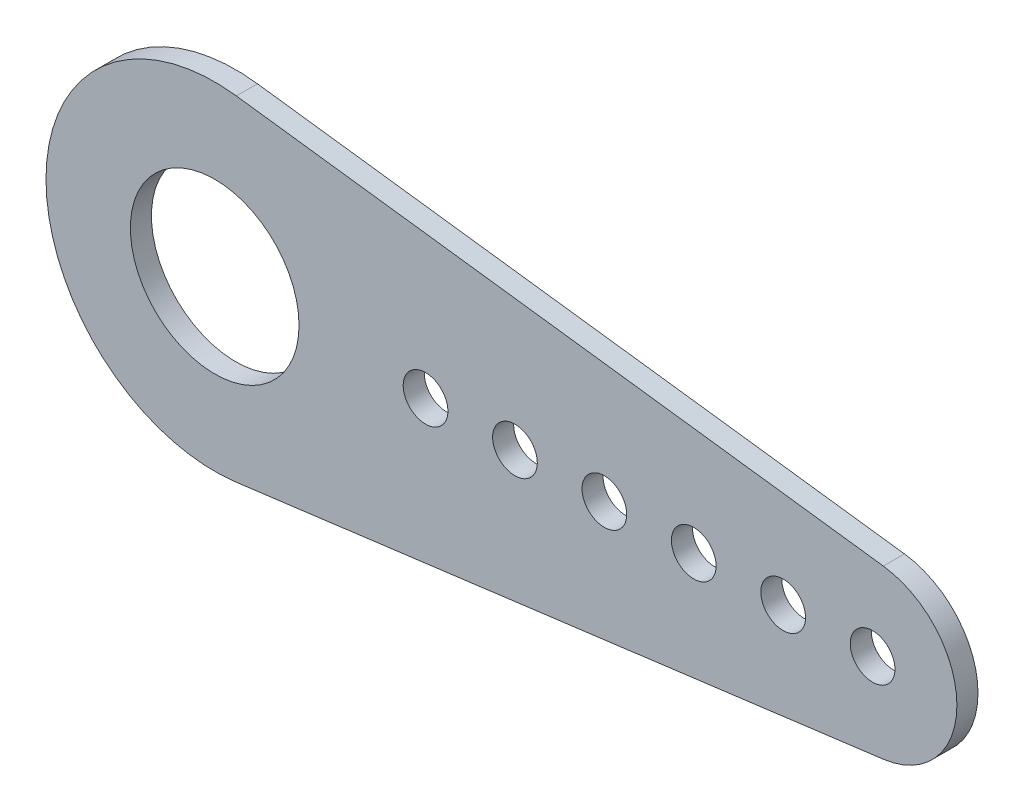
ISO-10303-21;
HEADER;
FILE_DESCRIPTION(('STEP AP214'),'2;1');
FILE_NAME('part.step','',(''),(''),'','','');
FILE_SCHEMA(('AUTOMOTIVE_DESIGN { 1 0 10303 214 1 1 1 1 }'));
ENDSEC;
DATA;
#1=APPLICATION_CONTEXT('core data for automotive mechanical design processes');
#2=APPLICATION_PROTOCOL_DEFINITION('international standard','automotive_design',2000,#1);
#3=PRODUCT_CONTEXT('',#1,'mechanical');
#4=PRODUCT('Part','Part','',(#3));
#5=PRODUCT_RELATED_PRODUCT_CATEGORY('part','',(#4));
#6=PRODUCT_DEFINITION_FORMATION('','',#4);
#7=PRODUCT_DEFINITION_CONTEXT('part definition',#1,'design');
#8=PRODUCT_DEFINITION('design','',#6,#7);
#9=PRODUCT_DEFINITION_SHAPE('','',#8);
#10=(LENGTH_UNIT() NAMED_UNIT(*) SI_UNIT(.MILLI.,.METRE.));
#11=(NAMED_UNIT(*) PLANE_ANGLE_UNIT() SI_UNIT($,.RADIAN.));
#12=(NAMED_UNIT(*) SI_UNIT($,.STERADIAN.) SOLID_ANGLE_UNIT());
#13=UNCERTAINTY_MEASURE_WITH_UNIT(LENGTH_MEASURE(1.E-05),#10,'distance_accuracy_value','');
#14=(GEOMETRIC_REPRESENTATION_CONTEXT(3) GLOBAL_UNCERTAINTY_ASSIGNED_CONTEXT((#13)) GLOBAL_UNIT_ASSIGNED_CONTEXT((#10,
#11,#12)) REPRESENTATION_CONTEXT('',''));
#15=CARTESIAN_POINT('',(0.,0.,0.));
#16=DIRECTION('',(0.,0.,1.));
#17=DIRECTION('',(1.,0.,0.));
#18=AXIS2_PLACEMENT_3D('',#15,#16,#17);
#19=CARTESIAN_POINT('',(0.,0.,3.175));
#20=DIRECTION('',(0.,0.,-1.));
#21=DIRECTION('',(-1.,0.,0.));
#22=AXIS2_PLACEMENT_3D('',#19,#20,#21);
#23=CYLINDRICAL_SURFACE('',#22,25.4);
#24=CARTESIAN_POINT('',(0.,0.,0.));
#25=DIRECTION('',(0.,0.,1.));
#26=DIRECTION('',(1.,0.,0.));
#27=AXIS2_PLACEMENT_3D('',#24,#25,#26);
#28=CIRCLE('',#27,25.4);
#29=CARTESIAN_POINT('',(3.25641025641026,25.1903908711625,0.));
#30=VERTEX_POINT('',#29);
#31=CARTESIAN_POINT('',(3.25641025641026,-25.1903908711625,0.));
#32=VERTEX_POINT('',#31);
#33=EDGE_CURVE('E120',#30,#32,#28,.T.);
#34=ORIENTED_EDGE('',*,*,#33,.T.);
#35=DIRECTION('',(0.,0.,-1.));
#36=VECTOR('',#35,1.);
#37=CARTESIAN_POINT('',(3.25641025641026,-25.1903908711625,3.175));
#38=LINE('',#37,#36);
#39=CARTESIAN_POINT('',(3.25641025641026,-25.1903908711625,3.175));
#40=VERTEX_POINT('',#39);
#41=EDGE_CURVE('E11',#40,#32,#38,.T.);
#42=ORIENTED_EDGE('',*,*,#41,.F.);
#43=CARTESIAN_POINT('',(0.,0.,3.175));
#44=DIRECTION('',(0.,0.,1.));
#45=DIRECTION('',(1.,0.,0.));
#46=AXIS2_PLACEMENT_3D('',#43,#44,#45);
#47=CIRCLE('',#46,25.4);
#48=CARTESIAN_POINT('',(3.25641025641026,25.1903908711625,3.175));
#49=VERTEX_POINT('',#48);
#50=EDGE_CURVE('E98',#49,#40,#47,.T.);
#51=ORIENTED_EDGE('',*,*,#50,.F.);
#52=DIRECTION('',(0.,0.,-1.));
#53=VECTOR('',#52,1.);
#54=CARTESIAN_POINT('',(3.25641025641026,25.1903908711625,3.175));
#55=LINE('',#54,#53);
#56=EDGE_CURVE('E65',#49,#30,#55,.T.);
#57=ORIENTED_EDGE('',*,*,#56,.T.);
#58=EDGE_LOOP('',(#34,#42,#51,#57));
#59=FACE_BOUND('',#58,.T.);
#60=ADVANCED_FACE('F47',(#59),#23,.T.);
#61=CARTESIAN_POINT('',(3.25641025641026,-25.1903908711625,3.175));
#62=DIRECTION('',(-0.128205128205128,0.991747672093011,0.));
#63=DIRECTION('',(-0.991747672093011,-0.128205128205128,0.));
#64=AXIS2_PLACEMENT_3D('',#61,#62,#63);
#65=PLANE('',#64);
#66=DIRECTION('',(0.991747672093011,0.128205128205128,0.));
#67=VECTOR('',#66,1.);
#68=CARTESIAN_POINT('',(3.25641025641026,-25.1903908711625,0.));
#69=LINE('',#68,#67);
#70=CARTESIAN_POINT('',(100.688205128205,-12.5951954355812,0.));
#71=VERTEX_POINT('',#70);
#72=EDGE_CURVE('E104',#32,#71,#69,.T.);
#73=ORIENTED_EDGE('',*,*,#72,.T.);
#74=DIRECTION('',(0.,0.,-1.));
#75=VECTOR('',#74,1.);
#76=CARTESIAN_POINT('',(100.688205128205,-12.5951954355812,3.175));
#77=LINE('',#76,#75);
#78=CARTESIAN_POINT('',(100.688205128205,-12.5951954355812,3.175));
#79=VERTEX_POINT('',#78);
#80=EDGE_CURVE('E57',#79,#71,#77,.T.);
#81=ORIENTED_EDGE('',*,*,#80,.F.);
#82=DIRECTION('',(0.991747672093011,0.128205128205128,0.));
#83=VECTOR('',#82,1.);
#84=CARTESIAN_POINT('',(3.25641025641026,-25.1903908711625,3.175));
#85=LINE('',#84,#83);
#86=EDGE_CURVE('E91',#40,#79,#85,.T.);
#87=ORIENTED_EDGE('',*,*,#86,.F.);
#88=ORIENTED_EDGE('',*,*,#41,.T.);
#89=EDGE_LOOP('',(#73,#81,#87,#88));
#90=FACE_BOUND('',#89,.T.);
#91=ADVANCED_FACE('F103',(#90),#65,.F.);
#92=CARTESIAN_POINT('',(99.06,0.,3.175));
#93=DIRECTION('',(0.,0.,-1.));
#94=DIRECTION('',(-1.,0.,0.));
#95=AXIS2_PLACEMENT_3D('',#92,#93,#94);
#96=CYLINDRICAL_SURFACE('',#95,12.7);
#97=CARTESIAN_POINT('',(99.06,0.,0.));
#98=DIRECTION('',(0.,0.,1.));
#99=DIRECTION('',(1.,0.,0.));
#100=AXIS2_PLACEMENT_3D('',#97,#98,#99);
#101=CIRCLE('',#100,12.7);
#102=CARTESIAN_POINT('',(100.688205128205,12.5951954355812,0.));
#103=VERTEX_POINT('',#102);
#104=EDGE_CURVE('E126',#71,#103,#101,.T.);
#105=ORIENTED_EDGE('',*,*,#104,.T.);
#106=DIRECTION('',(0.,0.,-1.));
#107=VECTOR('',#106,1.);
#108=CARTESIAN_POINT('',(100.688205128205,12.5951954355812,3.175));
#109=LINE('',#108,#107);
#110=CARTESIAN_POINT('',(100.688205128205,12.5951954355812,3.175));
#111=VERTEX_POINT('',#110);
#112=EDGE_CURVE('E80',#111,#103,#109,.T.);
#113=ORIENTED_EDGE('',*,*,#112,.F.);
#114=CARTESIAN_POINT('',(99.06,0.,3.175));
#115=DIRECTION('',(0.,0.,1.));
#116=DIRECTION('',(1.,0.,0.));
#117=AXIS2_PLACEMENT_3D('',#114,#115,#116);
#118=CIRCLE('',#117,12.7);
#119=EDGE_CURVE('E97',#79,#111,#118,.T.);
#120=ORIENTED_EDGE('',*,*,#119,.F.);
#121=ORIENTED_EDGE('',*,*,#80,.T.);
#122=EDGE_LOOP('',(#105,#113,#120,#121));
#123=FACE_BOUND('',#122,.T.);
#124=ADVANCED_FACE('F108',(#123),#96,.T.);
#125=CARTESIAN_POINT('',(0.,0.,3.175));
#126=DIRECTION('',(0.,0.,-1.));
#127=DIRECTION('',(-1.,0.,0.));
#128=AXIS2_PLACEMENT_3D('',#125,#126,#127);
#129=CYLINDRICAL_SURFACE('',#128,12.7);
#130=CARTESIAN_POINT('',(0.,0.,3.175));
#131=DIRECTION('',(0.,0.,1.));
#132=DIRECTION('',(1.,0.,0.));
#133=AXIS2_PLACEMENT_3D('',#130,#131,#132);
#134=CIRCLE('',#133,12.7);
#135=CARTESIAN_POINT('',(12.7,0.,3.175));
#136=VERTEX_POINT('',#135);
#137=EDGE_CURVE('E133',#136,#136,#134,.T.);
#138=ORIENTED_EDGE('',*,*,#137,.T.);
#139=EDGE_LOOP('',(#138));
#140=FACE_BOUND('',#139,.T.);
#141=CARTESIAN_POINT('',(0.,0.,0.));
#142=DIRECTION('',(0.,0.,1.));
#143=DIRECTION('',(1.,0.,0.));
#144=AXIS2_PLACEMENT_3D('',#141,#142,#143);
#145=CIRCLE('',#144,12.7);
#146=CARTESIAN_POINT('',(12.7,0.,0.));
#147=VERTEX_POINT('',#146);
#148=EDGE_CURVE('E116',#147,#147,#145,.T.);
#149=ORIENTED_EDGE('',*,*,#148,.F.);
#150=EDGE_LOOP('',(#149));
#151=FACE_BOUND('',#150,.T.);
#152=ADVANCED_FACE('F49',(#140,#151),#129,.F.);
#153=CARTESIAN_POINT('',(3.25641025641026,25.1903908711625,3.175));
#154=DIRECTION('',(0.128205128205128,0.991747672093011,0.));
#155=DIRECTION('',(-0.991747672093011,0.128205128205128,0.));
#156=AXIS2_PLACEMENT_3D('',#153,#154,#155);
#157=PLANE('',#156);
#158=DIRECTION('',(0.991747672093011,-0.128205128205128,0.));
#159=VECTOR('',#158,1.);
#160=CARTESIAN_POINT('',(3.25641025641026,25.1903908711625,0.));
#161=LINE('',#160,#159);
#162=EDGE_CURVE('E129',#30,#103,#161,.T.);
#163=ORIENTED_EDGE('',*,*,#162,.F.);
#164=ORIENTED_EDGE('',*,*,#56,.F.);
#165=DIRECTION('',(0.991747672093011,-0.128205128205128,0.));
#166=VECTOR('',#165,1.);
#167=CARTESIAN_POINT('',(3.25641025641026,25.1903908711625,3.175));
#168=LINE('',#167,#166);
#169=EDGE_CURVE('E110',#49,#111,#168,.T.);
#170=ORIENTED_EDGE('',*,*,#169,.T.);
#171=ORIENTED_EDGE('',*,*,#112,.T.);
#172=EDGE_LOOP('',(#163,#164,#170,#171));
#173=FACE_BOUND('',#172,.T.);
#174=ADVANCED_FACE('F205',(#173),#157,.T.);
#175=CARTESIAN_POINT('',(0.,0.,3.175));
#176=DIRECTION('',(0.,0.,1.));
#177=DIRECTION('',(1.,0.,0.));
#178=AXIS2_PLACEMENT_3D('',#175,#176,#177);
#179=PLANE('',#178);
#180=CARTESIAN_POINT('',(31.75,0.,3.175));
#181=DIRECTION('',(0.,0.,1.));
#182=DIRECTION('',(1.,0.,0.));
#183=AXIS2_PLACEMENT_3D('',#180,#181,#182);
#184=CIRCLE('',#183,3.3655);
#185=CARTESIAN_POINT('',(35.1155,0.,3.175));
#186=VERTEX_POINT('',#185);
#187=EDGE_CURVE('E121',#186,#186,#184,.T.);
#188=ORIENTED_EDGE('',*,*,#187,.F.);
#189=EDGE_LOOP('',(#188));
#190=FACE_BOUND('',#189,.T.);
#191=CARTESIAN_POINT('',(85.598,0.,3.175));
#192=DIRECTION('',(0.,0.,1.));
#193=DIRECTION('',(1.,0.,0.));
#194=AXIS2_PLACEMENT_3D('',#191,#192,#193);
#195=CIRCLE('',#194,3.36549999999999);
#196=CARTESIAN_POINT('',(88.9635,0.,3.175));
#197=VERTEX_POINT('',#196);
#198=EDGE_CURVE('E154',#197,#197,#195,.T.);
#199=ORIENTED_EDGE('',*,*,#198,.F.);
#200=EDGE_LOOP('',(#199));
#201=FACE_BOUND('',#200,.T.);
#202=CARTESIAN_POINT('',(99.06,0.,3.175));
#203=DIRECTION('',(0.,0.,1.));
#204=DIRECTION('',(1.,0.,0.));
#205=AXIS2_PLACEMENT_3D('',#202,#203,#204);
#206=CIRCLE('',#205,3.36549999999999);
#207=CARTESIAN_POINT('',(102.4255,0.,3.175));
#208=VERTEX_POINT('',#207);
#209=EDGE_CURVE('E145',#208,#208,#206,.T.);
#210=ORIENTED_EDGE('',*,*,#209,.F.);
#211=EDGE_LOOP('',(#210));
#212=FACE_BOUND('',#211,.T.);
#213=CARTESIAN_POINT('',(72.136,0.,3.175));
#214=DIRECTION('',(0.,0.,1.));
#215=DIRECTION('',(1.,0.,0.));
#216=AXIS2_PLACEMENT_3D('',#213,#214,#215);
#217=CIRCLE('',#216,3.36549999999999);
#218=CARTESIAN_POINT('',(75.5015,0.,3.175));
#219=VERTEX_POINT('',#218);
#220=EDGE_CURVE('E155',#219,#219,#217,.T.);
#221=ORIENTED_EDGE('',*,*,#220,.F.);
#222=EDGE_LOOP('',(#221));
#223=FACE_BOUND('',#222,.T.);
#224=CARTESIAN_POINT('',(58.674,0.,3.175));
#225=DIRECTION('',(0.,0.,1.));
#226=DIRECTION('',(1.,0.,0.));
#227=AXIS2_PLACEMENT_3D('',#224,#225,#226);
#228=CIRCLE('',#227,3.36549999999999);
#229=CARTESIAN_POINT('',(62.0395,0.,3.175));
#230=VERTEX_POINT('',#229);
#231=EDGE_CURVE('E163',#230,#230,#228,.T.);
#232=ORIENTED_EDGE('',*,*,#231,.F.);
#233=EDGE_LOOP('',(#232));
#234=FACE_BOUND('',#233,.T.);
#235=CARTESIAN_POINT('',(45.212,0.,3.175));
#236=DIRECTION('',(0.,0.,1.));
#237=DIRECTION('',(1.,0.,0.));
#238=AXIS2_PLACEMENT_3D('',#235,#236,#237);
#239=CIRCLE('',#238,3.3655);
#240=CARTESIAN_POINT('',(48.5775,0.,3.175));
#241=VERTEX_POINT('',#240);
#242=EDGE_CURVE('E171',#241,#241,#239,.T.);
#243=ORIENTED_EDGE('',*,*,#242,.F.);
#244=EDGE_LOOP('',(#243));
#245=FACE_BOUND('',#244,.T.);
#246=ORIENTED_EDGE('',*,*,#137,.F.);
#247=EDGE_LOOP('',(#246));
#248=FACE_BOUND('',#247,.T.);
#249=ORIENTED_EDGE('',*,*,#50,.T.);
#250=ORIENTED_EDGE('',*,*,#86,.T.);
#251=ORIENTED_EDGE('',*,*,#119,.T.);
#252=ORIENTED_EDGE('',*,*,#169,.F.);
#253=EDGE_LOOP('',(#249,#250,#251,#252));
#254=FACE_BOUND('',#253,.T.);
#255=ADVANCED_FACE('F94',(#190,#201,#212,#223,#234,#245,#248,#254),#179,.T.);
#256=CARTESIAN_POINT('',(0.,0.,0.));
#257=DIRECTION('',(0.,0.,1.));
#258=DIRECTION('',(1.,0.,0.));
#259=AXIS2_PLACEMENT_3D('',#256,#257,#258);
#260=PLANE('',#259);
#261=CARTESIAN_POINT('',(31.75,0.,0.));
#262=DIRECTION('',(0.,0.,1.));
#263=DIRECTION('',(1.,0.,0.));
#264=AXIS2_PLACEMENT_3D('',#261,#262,#263);
#265=CIRCLE('',#264,3.3655);
#266=CARTESIAN_POINT('',(35.1155,0.,0.));
#267=VERTEX_POINT('',#266);
#268=EDGE_CURVE('E175',#267,#267,#265,.T.);
#269=ORIENTED_EDGE('',*,*,#268,.T.);
#270=EDGE_LOOP('',(#269));
#271=FACE_BOUND('',#270,.T.);
#272=CARTESIAN_POINT('',(85.598,0.,0.));
#273=DIRECTION('',(0.,0.,1.));
#274=DIRECTION('',(1.,0.,0.));
#275=AXIS2_PLACEMENT_3D('',#272,#273,#274);
#276=CIRCLE('',#275,3.36549999999999);
#277=CARTESIAN_POINT('',(88.9635,0.,0.));
#278=VERTEX_POINT('',#277);
#279=EDGE_CURVE('E182',#278,#278,#276,.T.);
#280=ORIENTED_EDGE('',*,*,#279,.T.);
#281=EDGE_LOOP('',(#280));
#282=FACE_BOUND('',#281,.T.);
#283=CARTESIAN_POINT('',(99.06,0.,0.));
#284=DIRECTION('',(0.,0.,1.));
#285=DIRECTION('',(1.,0.,0.));
#286=AXIS2_PLACEMENT_3D('',#283,#284,#285);
#287=CIRCLE('',#286,3.36549999999999);
#288=CARTESIAN_POINT('',(102.4255,0.,0.));
#289=VERTEX_POINT('',#288);
#290=EDGE_CURVE('E150',#289,#289,#287,.T.);
#291=ORIENTED_EDGE('',*,*,#290,.T.);
#292=EDGE_LOOP('',(#291));
#293=FACE_BOUND('',#292,.T.);
#294=CARTESIAN_POINT('',(72.136,0.,0.));
#295=DIRECTION('',(0.,0.,1.));
#296=DIRECTION('',(1.,0.,0.));
#297=AXIS2_PLACEMENT_3D('',#294,#295,#296);
#298=CIRCLE('',#297,3.36549999999999);
#299=CARTESIAN_POINT('',(75.5015,0.,0.));
#300=VERTEX_POINT('',#299);
#301=EDGE_CURVE('E149',#300,#300,#298,.T.);
#302=ORIENTED_EDGE('',*,*,#301,.T.);
#303=EDGE_LOOP('',(#302));
#304=FACE_BOUND('',#303,.T.);
#305=CARTESIAN_POINT('',(58.674,0.,0.));
#306=DIRECTION('',(0.,0.,1.));
#307=DIRECTION('',(1.,0.,0.));
#308=AXIS2_PLACEMENT_3D('',#305,#306,#307);
#309=CIRCLE('',#308,3.36549999999999);
#310=CARTESIAN_POINT('',(62.0395,0.,0.));
#311=VERTEX_POINT('',#310);
#312=EDGE_CURVE('E159',#311,#311,#309,.T.);
#313=ORIENTED_EDGE('',*,*,#312,.T.);
#314=EDGE_LOOP('',(#313));
#315=FACE_BOUND('',#314,.T.);
#316=CARTESIAN_POINT('',(45.212,0.,0.));
#317=DIRECTION('',(0.,0.,1.));
#318=DIRECTION('',(1.,0.,0.));
#319=AXIS2_PLACEMENT_3D('',#316,#317,#318);
#320=CIRCLE('',#319,3.3655);
#321=CARTESIAN_POINT('',(48.5775,0.,0.));
#322=VERTEX_POINT('',#321);
#323=EDGE_CURVE('E167',#322,#322,#320,.T.);
#324=ORIENTED_EDGE('',*,*,#323,.T.);
#325=EDGE_LOOP('',(#324));
#326=FACE_BOUND('',#325,.T.);
#327=ORIENTED_EDGE('',*,*,#148,.T.);
#328=EDGE_LOOP('',(#327));
#329=FACE_BOUND('',#328,.T.);
#330=ORIENTED_EDGE('',*,*,#33,.F.);
#331=ORIENTED_EDGE('',*,*,#162,.T.);
#332=ORIENTED_EDGE('',*,*,#104,.F.);
#333=ORIENTED_EDGE('',*,*,#72,.F.);
#334=EDGE_LOOP('',(#330,#331,#332,#333));
#335=FACE_BOUND('',#334,.T.);
#336=ADVANCED_FACE('F193',(#271,#282,#293,#304,#315,#326,#329,#335),#260,.F.);
#337=CARTESIAN_POINT('',(45.212,0.,12.6940714883333));
#338=DIRECTION('',(0.,0.,-1.));
#339=DIRECTION('',(-1.,0.,0.));
#340=AXIS2_PLACEMENT_3D('',#337,#338,#339);
#341=CYLINDRICAL_SURFACE('',#340,3.3655);
#342=ORIENTED_EDGE('',*,*,#323,.F.);
#343=EDGE_LOOP('',(#342));
#344=FACE_BOUND('',#343,.T.);
#345=ORIENTED_EDGE('',*,*,#242,.T.);
#346=EDGE_LOOP('',(#345));
#347=FACE_BOUND('',#346,.T.);
#348=ADVANCED_FACE('F218',(#344,#347),#341,.F.);
#349=CARTESIAN_POINT('',(58.674,0.,12.6940714883333));
#350=DIRECTION('',(0.,0.,-1.));
#351=DIRECTION('',(-1.,0.,0.));
#352=AXIS2_PLACEMENT_3D('',#349,#350,#351);
#353=CYLINDRICAL_SURFACE('',#352,3.36549999999999);
#354=ORIENTED_EDGE('',*,*,#312,.F.);
#355=EDGE_LOOP('',(#354));
#356=FACE_BOUND('',#355,.T.);
#357=ORIENTED_EDGE('',*,*,#231,.T.);
#358=EDGE_LOOP('',(#357));
#359=FACE_BOUND('',#358,.T.);
#360=ADVANCED_FACE('F220',(#356,#359),#353,.F.);
#361=CARTESIAN_POINT('',(72.136,0.,12.6940714883333));
#362=DIRECTION('',(0.,0.,-1.));
#363=DIRECTION('',(-1.,0.,0.));
#364=AXIS2_PLACEMENT_3D('',#361,#362,#363);
#365=CYLINDRICAL_SURFACE('',#364,3.36549999999999);
#366=ORIENTED_EDGE('',*,*,#301,.F.);
#367=EDGE_LOOP('',(#366));
#368=FACE_BOUND('',#367,.T.);
#369=ORIENTED_EDGE('',*,*,#220,.T.);
#370=EDGE_LOOP('',(#369));
#371=FACE_BOUND('',#370,.T.);
#372=ADVANCED_FACE('F227',(#368,#371),#365,.F.);
#373=CARTESIAN_POINT('',(99.06,0.,12.6940714883333));
#374=DIRECTION('',(0.,0.,-1.));
#375=DIRECTION('',(-1.,0.,0.));
#376=AXIS2_PLACEMENT_3D('',#373,#374,#375);
#377=CYLINDRICAL_SURFACE('',#376,3.36549999999999);
#378=ORIENTED_EDGE('',*,*,#290,.F.);
#379=EDGE_LOOP('',(#378));
#380=FACE_BOUND('',#379,.T.);
#381=ORIENTED_EDGE('',*,*,#209,.T.);
#382=EDGE_LOOP('',(#381));
#383=FACE_BOUND('',#382,.T.);
#384=ADVANCED_FACE('F243',(#380,#383),#377,.F.);
#385=CARTESIAN_POINT('',(85.598,0.,12.6940714883333));
#386=DIRECTION('',(0.,0.,-1.));
#387=DIRECTION('',(-1.,0.,0.));
#388=AXIS2_PLACEMENT_3D('',#385,#386,#387);
#389=CYLINDRICAL_SURFACE('',#388,3.36549999999999);
#390=ORIENTED_EDGE('',*,*,#279,.F.);
#391=EDGE_LOOP('',(#390));
#392=FACE_BOUND('',#391,.T.);
#393=ORIENTED_EDGE('',*,*,#198,.T.);
#394=EDGE_LOOP('',(#393));
#395=FACE_BOUND('',#394,.T.);
#396=ADVANCED_FACE('F199',(#392,#395),#389,.F.);
#397=CARTESIAN_POINT('',(31.75,0.,12.6940714883333));
#398=DIRECTION('',(0.,0.,-1.));
#399=DIRECTION('',(-1.,0.,0.));
#400=AXIS2_PLACEMENT_3D('',#397,#398,#399);
#401=CYLINDRICAL_SURFACE('',#400,3.3655);
#402=ORIENTED_EDGE('',*,*,#268,.F.);
#403=EDGE_LOOP('',(#402));
#404=FACE_BOUND('',#403,.T.);
#405=ORIENTED_EDGE('',*,*,#187,.T.);
#406=EDGE_LOOP('',(#405));
#407=FACE_BOUND('',#406,.T.);
#408=ADVANCED_FACE('F196',(#404,#407),#401,.F.);
#409=CLOSED_SHELL('',(#60,#91,#124,#152,#174,#255,#336,#348,#360,#372,#384,#396,#408));
#410=MANIFOLD_SOLID_BREP('B2',#409);
#411=ADVANCED_BREP_SHAPE_REPRESENTATION('',(#18,#410),#14);
#412=SHAPE_DEFINITION_REPRESENTATION(#9,#411);
ENDSEC;
END-ISO-10303-21;
